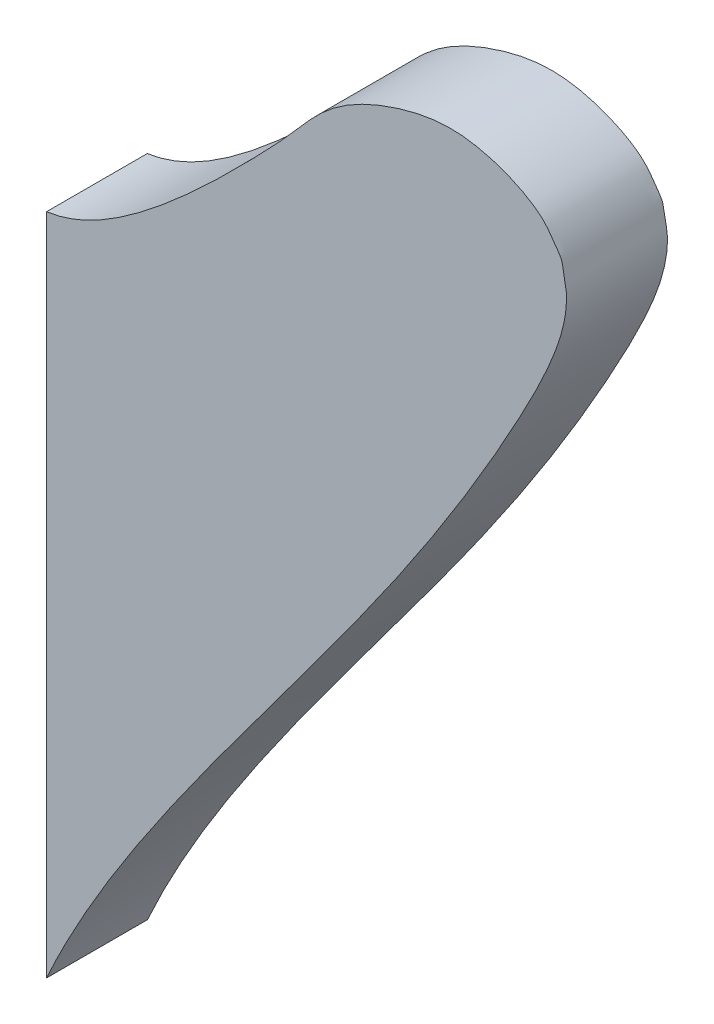
ISO-10303-21;
HEADER;
FILE_DESCRIPTION(('STEP AP214'),'2;1');
FILE_NAME('part.step','',(''),(''),'','','');
FILE_SCHEMA(('AUTOMOTIVE_DESIGN { 1 0 10303 214 1 1 1 1 }'));
ENDSEC;
DATA;
#1=APPLICATION_CONTEXT('core data for automotive mechanical design processes');
#2=APPLICATION_PROTOCOL_DEFINITION('international standard','automotive_design',2000,#1);
#3=PRODUCT_CONTEXT('',#1,'mechanical');
#4=PRODUCT('Part','Part','',(#3));
#5=PRODUCT_RELATED_PRODUCT_CATEGORY('part','',(#4));
#6=PRODUCT_DEFINITION_FORMATION('','',#4);
#7=PRODUCT_DEFINITION_CONTEXT('part definition',#1,'design');
#8=PRODUCT_DEFINITION('design','',#6,#7);
#9=PRODUCT_DEFINITION_SHAPE('','',#8);
#10=(LENGTH_UNIT() NAMED_UNIT(*) SI_UNIT(.MILLI.,.METRE.));
#11=(NAMED_UNIT(*) PLANE_ANGLE_UNIT() SI_UNIT($,.RADIAN.));
#12=(NAMED_UNIT(*) SI_UNIT($,.STERADIAN.) SOLID_ANGLE_UNIT());
#13=UNCERTAINTY_MEASURE_WITH_UNIT(LENGTH_MEASURE(1.E-05),#10,'distance_accuracy_value','');
#14=(GEOMETRIC_REPRESENTATION_CONTEXT(3) GLOBAL_UNCERTAINTY_ASSIGNED_CONTEXT((#13)) GLOBAL_UNIT_ASSIGNED_CONTEXT((#10,
#11,#12)) REPRESENTATION_CONTEXT('',''));
#15=CARTESIAN_POINT('',(0.,0.,0.));
#16=DIRECTION('',(0.,0.,1.));
#17=DIRECTION('',(1.,0.,0.));
#18=AXIS2_PLACEMENT_3D('',#15,#16,#17);
#19=CARTESIAN_POINT('',(56.6243968883205,-75.8826484864378,67.9999999999997));
#20=CARTESIAN_POINT('',(57.1956425116259,-74.6192572399872,67.9999999999997));
#21=CARTESIAN_POINT('',(57.8105643251966,-73.3695682454955,67.9999999999997));
#22=CARTESIAN_POINT('',(59.1129866999376,-70.8929599230149,67.9999999999997));
#23=CARTESIAN_POINT('',(59.7959511164579,-69.6735801309141,67.9999999999997));
#24=CARTESIAN_POINT('',(61.9128506956345,-66.0658431265041,67.9999999999997));
#25=CARTESIAN_POINT('',(63.41586879737,-63.7233398847035,67.9999999999997));
#26=CARTESIAN_POINT('',(68.0819544074626,-56.8030625835978,67.9999999999997));
#27=CARTESIAN_POINT('',(71.4008035720881,-52.3316675973996,67.9999999999997));
#28=CARTESIAN_POINT('',(76.3852152204365,-45.6287665247062,67.9999999999997));
#29=CARTESIAN_POINT('',(78.0490180191963,-43.3961231201857,67.9999999999997));
#30=CARTESIAN_POINT('',(81.3313667037283,-38.8995837933962,67.9999999999997));
#31=CARTESIAN_POINT('',(82.9473868043948,-36.6338927930608,67.9999999999997));
#32=CARTESIAN_POINT('',(86.0891610997712,-32.0399943871268,67.9999999999997));
#33=CARTESIAN_POINT('',(87.6164996172124,-29.710641318691,67.9999999999997));
#34=CARTESIAN_POINT('',(90.5528850923564,-24.9805780795596,67.9999999999997));
#35=CARTESIAN_POINT('',(91.9619280402937,-22.5832158701367,67.9999999999997));
#36=CARTESIAN_POINT('',(93.978468678918,-18.9341404799284,67.9999999999997));
#37=CARTESIAN_POINT('',(94.6360575792324,-17.7098065740976,67.9999999999997));
#38=CARTESIAN_POINT('',(95.5715451861119,-15.8454866914508,67.9999999999997));
#39=CARTESIAN_POINT('',(95.8742446304546,-15.2190565106268,67.9999999999997));
#40=CARTESIAN_POINT('',(96.4512459088168,-13.9506743441176,67.9999999999997));
#41=CARTESIAN_POINT('',(96.7253232789207,-13.3065549937712,67.9999999999997));
#42=CARTESIAN_POINT('',(97.2132446147879,-11.9946956240635,67.9999999999997));
#43=CARTESIAN_POINT('',(97.4262601888033,-11.3309091214542,67.9999999999997));
#44=CARTESIAN_POINT('',(97.6628361617602,-10.314169405239,67.9999999999997));
#45=CARTESIAN_POINT('',(97.7292554690413,-9.97209787235811,67.9999999999997));
#46=CARTESIAN_POINT('',(97.8248604442845,-9.27850135593702,67.9999999999997));
#47=CARTESIAN_POINT('',(97.8541019998468,-8.92396257798465,67.9999999999997));
#48=CARTESIAN_POINT('',(97.8479479734428,-8.40104089081836,67.9999999999997));
#49=CARTESIAN_POINT('',(97.8367540764815,-8.22785762024196,67.9999999999997));
#50=CARTESIAN_POINT('',(97.7953918159734,-7.88382374353646,67.9999999999997));
#51=CARTESIAN_POINT('',(97.7655108981713,-7.71293779968312,67.9999999999997));
#52=CARTESIAN_POINT('',(97.698003967446,-7.37211807091851,67.9999999999997));
#53=CARTESIAN_POINT('',(97.660404923098,-7.20218097057089,67.9999999999997));
#54=CARTESIAN_POINT('',(97.5952035175329,-6.86107780740515,67.9999999999997));
#55=CARTESIAN_POINT('',(97.5683680297231,-6.6898174674528,67.9999999999997));
#56=CARTESIAN_POINT('',(97.5221756562163,-6.43365709793925,67.9999999999997));
#57=CARTESIAN_POINT('',(97.5048911608089,-6.34820363557533,67.9999999999997));
#58=CARTESIAN_POINT('',(97.4554190660572,-6.18037958094073,67.9999999999997));
#59=CARTESIAN_POINT('',(97.4225272093168,-6.10086409438284,67.9999999999997));
#60=CARTESIAN_POINT('',(97.3042566038001,-5.87288070300916,67.9999999999997));
#61=CARTESIAN_POINT('',(97.2031984763459,-5.73276328046378,67.9999999999997));
#62=CARTESIAN_POINT('',(97.0045827628487,-5.45111324761475,67.9999999999997));
#63=CARTESIAN_POINT('',(96.9054512594845,-5.31015763601441,67.9999999999997));
#64=CARTESIAN_POINT('',(96.7081345218982,-5.02754567103159,67.9999999999997));
#65=CARTESIAN_POINT('',(96.6081502047399,-4.88722159461685,67.9999999999997));
#66=CARTESIAN_POINT('',(96.4003822347995,-4.61234909281722,67.9999999999997));
#67=CARTESIAN_POINT('',(96.292989024648,-4.47715754013075,67.9999999999997));
#68=CARTESIAN_POINT('',(96.0627559638792,-4.21968321423377,67.9999999999997));
#69=CARTESIAN_POINT('',(95.9414461805903,-4.09958875898011,67.9999999999997));
#70=CARTESIAN_POINT('',(95.5611603474355,-3.7621309270953,67.9999999999997));
#71=CARTESIAN_POINT('',(95.2866088678593,-3.56650312113814,67.9999999999997));
#72=CARTESIAN_POINT('',(94.4294430314856,-3.02638498457516,67.9999999999997));
#73=CARTESIAN_POINT('',(93.8139023894578,-2.72256695794317,67.9999999999997));
#74=CARTESIAN_POINT('',(92.5612042312695,-2.21843912980432,67.9999999999997));
#75=CARTESIAN_POINT('',(91.9199730880059,-2.01202844692416,67.9999999999997));
#76=CARTESIAN_POINT('',(90.6050828614641,-1.69868523322686,67.9999999999997));
#77=CARTESIAN_POINT('',(89.9268677341821,-1.59222116346258,67.9999999999997));
#78=CARTESIAN_POINT('',(88.5840345823411,-1.51505723300655,67.9999999999997));
#79=CARTESIAN_POINT('',(87.9141205312446,-1.54368907805067,67.9999999999997));
#80=CARTESIAN_POINT('',(86.5767767620458,-1.71208669676027,67.9999999999997));
#81=CARTESIAN_POINT('',(85.9076331180618,-1.85264133443855,67.9999999999997));
#82=CARTESIAN_POINT('',(84.6060044032569,-2.20226527120153,67.9999999999997));
#83=CARTESIAN_POINT('',(83.9670295398703,-2.40917016426315,67.9999999999997));
#84=CARTESIAN_POINT('',(82.7113221132215,-2.88327141737424,67.9999999999997));
#85=CARTESIAN_POINT('',(82.094723005275,-3.150829530332,67.9999999999997));
#86=CARTESIAN_POINT('',(81.1919669300859,-3.61218787695929,67.9999999999997));
#87=CARTESIAN_POINT('',(80.893524101022,-3.7769713549058,67.9999999999997));
#88=CARTESIAN_POINT('',(80.3125081029548,-4.12624263406909,67.9999999999997));
#89=CARTESIAN_POINT('',(80.0304640743729,-4.31043748003391,67.9999999999997));
#90=CARTESIAN_POINT('',(79.2107847023737,-4.8928977070669,67.9999999999997));
#91=CARTESIAN_POINT('',(78.7004299539818,-5.32197378620994,67.9999999999997));
#92=CARTESIAN_POINT('',(77.7427371771104,-6.25129701422813,67.9999999999997));
#93=CARTESIAN_POINT('',(77.292852530074,-6.74866801266026,67.9999999999997));
#94=CARTESIAN_POINT('',(76.4034403788606,-7.75510736441196,67.9999999999997));
#95=CARTESIAN_POINT('',(75.9653873495744,-8.26535440307391,67.9999999999997));
#96=CARTESIAN_POINT('',(74.6246472010139,-9.76999906766912,67.9999999999997));
#97=CARTESIAN_POINT('',(73.6898354937796,-10.734128970733,67.9999999999997));
#98=CARTESIAN_POINT('',(71.8014456593892,-12.6445465541986,67.9999999999997));
#99=CARTESIAN_POINT('',(70.8520595026556,-13.5956663871862,67.9999999999997));
#100=CARTESIAN_POINT('',(68.9187317899475,-15.4597570797874,67.9999999999997));
#101=CARTESIAN_POINT('',(67.9327373498953,-16.3704268166374,67.9999999999997));
#102=CARTESIAN_POINT('',(65.9084702095195,-18.1339573958019,67.9999999999997));
#103=CARTESIAN_POINT('',(64.8687643562038,-18.9907957412065,67.9999999999997));
#104=CARTESIAN_POINT('',(63.2554638408371,-20.1886633041375,67.9999999999997));
#105=CARTESIAN_POINT('',(62.7084520293485,-20.5731669126561,67.9999999999997));
#106=CARTESIAN_POINT('',(61.5884755974614,-21.3006675392165,67.9999999999997));
#107=CARTESIAN_POINT('',(61.0156489552363,-21.6438852271502,67.9999999999997));
#108=CARTESIAN_POINT('',(60.1273087559626,-22.1121714566125,67.9999999999997));
#109=CARTESIAN_POINT('',(59.8262928684722,-22.2604262680865,67.9999999999997));
#110=CARTESIAN_POINT('',(59.2118356959093,-22.5370638266758,67.9999999999997));
#111=CARTESIAN_POINT('',(58.8968514073404,-22.6659741589894,67.9999999999997));
#112=CARTESIAN_POINT('',(57.9418356908704,-23.009389244802,67.9999999999997));
#113=CARTESIAN_POINT('',(57.2922297792434,-23.1812096780764,67.9999999999997));
#114=CARTESIAN_POINT('',(56.6243968883146,-23.2724981523089,67.9999999999997));
#115=B_SPLINE_CURVE_WITH_KNOTS('',3,(#19,#20,#21,#22,#23,#24,#25,#26,#27,#28,#29,#30,#31,#32,
#33,#34,#35,#36,#37,#38,#39,#40,#41,#42,#43,#44,#45,#46,#47,#48,#49,#50,#51,#52,#53,#54,#55,#56,
#57,#58,#59,#60,#61,#62,#63,#64,#65,#66,#67,#68,#69,#70,#71,#72,#73,#74,#75,#76,#77,#78,#79,#80,
#81,#82,#83,#84,#85,#86,#87,#88,#89,#90,#91,#92,#93,#94,#95,#96,#97,#98,#99,#100,#101,#102,#103,
#104,#105,#106,#107,#108,#109,#110,#111,#112,#113,#114),.UNSPECIFIED.,.F.,.F.,(4,2,2,2,2,2,2,2,
2,2,2,2,2,2,2,2,2,2,2,2,2,2,2,2,2,2,2,2,2,2,2,2,2,2,2,2,2,2,2,2,2,2,2,2,2,2,2,4),(0.,
0.0312499999999996,0.062499999999999,0.124999999999998,0.249999999999995,0.312499999999994,
0.374999999999993,0.437499999999992,0.499999999999991,0.53124999999999,0.54687499999999,
0.56249999999999,0.578124999999989,0.585937499999989,0.593749999999989,0.597656249999989,
0.601562499999989,0.605468749999989,0.609374999999989,0.611328124999989,0.613281249999989,
0.617187499999989,0.621093749999989,0.624999999999988,0.628906249999988,0.632812499999988,
0.640624999999989,0.656249999999989,0.671874999999989,0.68749999999999,0.70312499999999,
0.71874999999999,0.734374999999991,0.749999999999991,0.757812499999991,0.765624999999991,
0.781249999999992,0.796874999999993,0.812499999999993,0.843749999999995,0.874999999999996,
0.906249999999997,0.937499999999998,0.953124999999999,0.968749999999999,0.976562499999999,
0.984375,1.),.UNSPECIFIED.);
#116=DIRECTION('',(0.,0.,-1.));
#117=VECTOR('',#116,1.);
#118=SURFACE_OF_LINEAR_EXTRUSION('',#115,#117);
#119=CARTESIAN_POINT('',(56.6243968883205,-75.8826484864378,59.9999999999998));
#120=CARTESIAN_POINT('',(57.1956425116259,-74.6192572399872,59.9999999999998));
#121=CARTESIAN_POINT('',(57.8105643251966,-73.3695682454955,59.9999999999998));
#122=CARTESIAN_POINT('',(59.1129866999376,-70.8929599230149,59.9999999999998));
#123=CARTESIAN_POINT('',(59.7959511164579,-69.6735801309141,59.9999999999998));
#124=CARTESIAN_POINT('',(61.9128506956345,-66.0658431265041,59.9999999999998));
#125=CARTESIAN_POINT('',(63.41586879737,-63.7233398847035,59.9999999999998));
#126=CARTESIAN_POINT('',(68.0819544074626,-56.8030625835978,59.9999999999998));
#127=CARTESIAN_POINT('',(71.4008035720881,-52.3316675973996,59.9999999999998));
#128=CARTESIAN_POINT('',(76.3852152204365,-45.6287665247062,59.9999999999998));
#129=CARTESIAN_POINT('',(78.0490180191963,-43.3961231201857,59.9999999999998));
#130=CARTESIAN_POINT('',(81.3313667037283,-38.8995837933962,59.9999999999998));
#131=CARTESIAN_POINT('',(82.9473868043948,-36.6338927930608,59.9999999999998));
#132=CARTESIAN_POINT('',(86.0891610997712,-32.0399943871268,59.9999999999998));
#133=CARTESIAN_POINT('',(87.6164996172124,-29.710641318691,59.9999999999998));
#134=CARTESIAN_POINT('',(90.5528850923564,-24.9805780795596,59.9999999999998));
#135=CARTESIAN_POINT('',(91.9619280402937,-22.5832158701367,59.9999999999998));
#136=CARTESIAN_POINT('',(93.978468678918,-18.9341404799284,59.9999999999998));
#137=CARTESIAN_POINT('',(94.6360575792324,-17.7098065740976,59.9999999999998));
#138=CARTESIAN_POINT('',(95.5715451861119,-15.8454866914508,59.9999999999998));
#139=CARTESIAN_POINT('',(95.8742446304546,-15.2190565106268,59.9999999999998));
#140=CARTESIAN_POINT('',(96.4512459088168,-13.9506743441176,59.9999999999998));
#141=CARTESIAN_POINT('',(96.7253232789207,-13.3065549937712,59.9999999999998));
#142=CARTESIAN_POINT('',(97.2132446147879,-11.9946956240635,59.9999999999998));
#143=CARTESIAN_POINT('',(97.4262601888033,-11.3309091214542,59.9999999999998));
#144=CARTESIAN_POINT('',(97.6628361617602,-10.314169405239,59.9999999999998));
#145=CARTESIAN_POINT('',(97.7292554690413,-9.97209787235811,59.9999999999998));
#146=CARTESIAN_POINT('',(97.8248604442845,-9.27850135593702,59.9999999999998));
#147=CARTESIAN_POINT('',(97.8541019998468,-8.92396257798465,59.9999999999998));
#148=CARTESIAN_POINT('',(97.8479479734428,-8.40104089081836,59.9999999999998));
#149=CARTESIAN_POINT('',(97.8367540764815,-8.22785762024196,59.9999999999998));
#150=CARTESIAN_POINT('',(97.7953918159734,-7.88382374353646,59.9999999999998));
#151=CARTESIAN_POINT('',(97.7655108981713,-7.71293779968312,59.9999999999998));
#152=CARTESIAN_POINT('',(97.698003967446,-7.37211807091851,59.9999999999998));
#153=CARTESIAN_POINT('',(97.660404923098,-7.20218097057089,59.9999999999998));
#154=CARTESIAN_POINT('',(97.5952035175329,-6.86107780740515,59.9999999999998));
#155=CARTESIAN_POINT('',(97.5683680297231,-6.6898174674528,59.9999999999998));
#156=CARTESIAN_POINT('',(97.5221756562163,-6.43365709793925,59.9999999999998));
#157=CARTESIAN_POINT('',(97.5048911608089,-6.34820363557533,59.9999999999998));
#158=CARTESIAN_POINT('',(97.4554190660572,-6.18037958094073,59.9999999999998));
#159=CARTESIAN_POINT('',(97.4225272093168,-6.10086409438284,59.9999999999998));
#160=CARTESIAN_POINT('',(97.3042566038001,-5.87288070300916,59.9999999999998));
#161=CARTESIAN_POINT('',(97.2031984763459,-5.73276328046378,59.9999999999998));
#162=CARTESIAN_POINT('',(97.0045827628487,-5.45111324761475,59.9999999999998));
#163=CARTESIAN_POINT('',(96.9054512594845,-5.31015763601441,59.9999999999998));
#164=CARTESIAN_POINT('',(96.7081345218982,-5.02754567103159,59.9999999999998));
#165=CARTESIAN_POINT('',(96.6081502047399,-4.88722159461685,59.9999999999998));
#166=CARTESIAN_POINT('',(96.4003822347995,-4.61234909281722,59.9999999999998));
#167=CARTESIAN_POINT('',(96.292989024648,-4.47715754013075,59.9999999999998));
#168=CARTESIAN_POINT('',(96.0627559638792,-4.21968321423377,59.9999999999998));
#169=CARTESIAN_POINT('',(95.9414461805903,-4.09958875898011,59.9999999999998));
#170=CARTESIAN_POINT('',(95.5611603474355,-3.7621309270953,59.9999999999998));
#171=CARTESIAN_POINT('',(95.2866088678593,-3.56650312113814,59.9999999999998));
#172=CARTESIAN_POINT('',(94.4294430314856,-3.02638498457516,59.9999999999998));
#173=CARTESIAN_POINT('',(93.8139023894578,-2.72256695794317,59.9999999999998));
#174=CARTESIAN_POINT('',(92.5612042312695,-2.21843912980432,59.9999999999998));
#175=CARTESIAN_POINT('',(91.9199730880059,-2.01202844692416,59.9999999999998));
#176=CARTESIAN_POINT('',(90.6050828614641,-1.69868523322686,59.9999999999998));
#177=CARTESIAN_POINT('',(89.9268677341821,-1.59222116346258,59.9999999999998));
#178=CARTESIAN_POINT('',(88.5840345823411,-1.51505723300655,59.9999999999998));
#179=CARTESIAN_POINT('',(87.9141205312446,-1.54368907805067,59.9999999999998));
#180=CARTESIAN_POINT('',(86.5767767620458,-1.71208669676027,59.9999999999998));
#181=CARTESIAN_POINT('',(85.9076331180618,-1.85264133443855,59.9999999999998));
#182=CARTESIAN_POINT('',(84.6060044032569,-2.20226527120153,59.9999999999998));
#183=CARTESIAN_POINT('',(83.9670295398703,-2.40917016426315,59.9999999999998));
#184=CARTESIAN_POINT('',(82.7113221132215,-2.88327141737424,59.9999999999998));
#185=CARTESIAN_POINT('',(82.094723005275,-3.150829530332,59.9999999999998));
#186=CARTESIAN_POINT('',(81.1919669300859,-3.61218787695929,59.9999999999998));
#187=CARTESIAN_POINT('',(80.893524101022,-3.7769713549058,59.9999999999998));
#188=CARTESIAN_POINT('',(80.3125081029548,-4.12624263406909,59.9999999999998));
#189=CARTESIAN_POINT('',(80.0304640743729,-4.31043748003391,59.9999999999998));
#190=CARTESIAN_POINT('',(79.2107847023737,-4.8928977070669,59.9999999999998));
#191=CARTESIAN_POINT('',(78.7004299539818,-5.32197378620994,59.9999999999998));
#192=CARTESIAN_POINT('',(77.7427371771104,-6.25129701422813,59.9999999999998));
#193=CARTESIAN_POINT('',(77.292852530074,-6.74866801266026,59.9999999999998));
#194=CARTESIAN_POINT('',(76.4034403788606,-7.75510736441196,59.9999999999998));
#195=CARTESIAN_POINT('',(75.9653873495744,-8.26535440307391,59.9999999999998));
#196=CARTESIAN_POINT('',(74.6246472010139,-9.76999906766912,59.9999999999998));
#197=CARTESIAN_POINT('',(73.6898354937796,-10.734128970733,59.9999999999998));
#198=CARTESIAN_POINT('',(71.8014456593892,-12.6445465541986,59.9999999999998));
#199=CARTESIAN_POINT('',(70.8520595026556,-13.5956663871862,59.9999999999998));
#200=CARTESIAN_POINT('',(68.9187317899475,-15.4597570797874,59.9999999999998));
#201=CARTESIAN_POINT('',(67.9327373498953,-16.3704268166374,59.9999999999998));
#202=CARTESIAN_POINT('',(65.9084702095195,-18.1339573958019,59.9999999999998));
#203=CARTESIAN_POINT('',(64.8687643562038,-18.9907957412065,59.9999999999998));
#204=CARTESIAN_POINT('',(63.2554638408371,-20.1886633041375,59.9999999999998));
#205=CARTESIAN_POINT('',(62.7084520293485,-20.5731669126561,59.9999999999998));
#206=CARTESIAN_POINT('',(61.5884755974614,-21.3006675392165,59.9999999999998));
#207=CARTESIAN_POINT('',(61.0156489552363,-21.6438852271502,59.9999999999998));
#208=CARTESIAN_POINT('',(60.1273087559626,-22.1121714566125,59.9999999999998));
#209=CARTESIAN_POINT('',(59.8262928684722,-22.2604262680865,59.9999999999998));
#210=CARTESIAN_POINT('',(59.2118356959093,-22.5370638266758,59.9999999999998));
#211=CARTESIAN_POINT('',(58.8968514073404,-22.6659741589894,59.9999999999998));
#212=CARTESIAN_POINT('',(57.9418356908704,-23.009389244802,59.9999999999998));
#213=CARTESIAN_POINT('',(57.2922297792434,-23.1812096780764,59.9999999999998));
#214=CARTESIAN_POINT('',(56.6243968883146,-23.2724981523089,59.9999999999998));
#215=B_SPLINE_CURVE_WITH_KNOTS('',3,(#119,#120,#121,#122,#123,#124,#125,#126,#127,#128,#129,
#130,#131,#132,#133,#134,#135,#136,#137,#138,#139,#140,#141,#142,#143,#144,#145,#146,#147,#148,
#149,#150,#151,#152,#153,#154,#155,#156,#157,#158,#159,#160,#161,#162,#163,#164,#165,#166,#167,
#168,#169,#170,#171,#172,#173,#174,#175,#176,#177,#178,#179,#180,#181,#182,#183,#184,#185,#186,
#187,#188,#189,#190,#191,#192,#193,#194,#195,#196,#197,#198,#199,#200,#201,#202,#203,#204,#205,
#206,#207,#208,#209,#210,#211,#212,#213,#214),.UNSPECIFIED.,.F.,.F.,(4,2,2,2,2,2,2,2,2,2,2,2,2,
2,2,2,2,2,2,2,2,2,2,2,2,2,2,2,2,2,2,2,2,2,2,2,2,2,2,2,2,2,2,2,2,2,2,4),(0.,0.0312499999999996,
0.062499999999999,0.124999999999998,0.249999999999995,0.312499999999994,0.374999999999993,
0.437499999999992,0.499999999999991,0.53124999999999,0.54687499999999,0.56249999999999,
0.578124999999989,0.585937499999989,0.593749999999989,0.597656249999989,0.601562499999989,
0.605468749999989,0.609374999999989,0.611328124999989,0.613281249999989,0.617187499999989,
0.621093749999989,0.624999999999988,0.628906249999988,0.632812499999988,0.640624999999989,
0.656249999999989,0.671874999999989,0.68749999999999,0.70312499999999,0.71874999999999,
0.734374999999991,0.749999999999991,0.757812499999991,0.765624999999991,0.781249999999992,
0.796874999999993,0.812499999999993,0.843749999999995,0.874999999999996,0.906249999999997,
0.937499999999998,0.953124999999999,0.968749999999999,0.976562499999999,0.984375,1.),.UNSPECIFIED.);
#216=CARTESIAN_POINT('',(56.6243968883148,-75.8826484864506,59.9999999999997));
#217=VERTEX_POINT('',#216);
#218=CARTESIAN_POINT('',(56.6243968883148,-23.2724981523089,59.9999999999997));
#219=VERTEX_POINT('',#218);
#220=EDGE_CURVE('E65',#217,#219,#215,.T.);
#221=ORIENTED_EDGE('',*,*,#220,.T.);
#222=DIRECTION('',(0.,0.,-1.));
#223=VECTOR('',#222,1.);
#224=CARTESIAN_POINT('',(56.6243968883148,-23.2724981523089,67.9999999999997));
#225=LINE('',#224,#223);
#226=CARTESIAN_POINT('',(56.6243968883148,-23.2724981523089,67.9999999999997));
#227=VERTEX_POINT('',#226);
#228=EDGE_CURVE('E11',#227,#219,#225,.T.);
#229=ORIENTED_EDGE('',*,*,#228,.F.);
#230=CARTESIAN_POINT('',(56.6243968883146,-23.2724981523089,67.9999999999997));
#231=CARTESIAN_POINT('',(57.2922297792434,-23.1812096780764,67.9999999999997));
#232=CARTESIAN_POINT('',(57.9418356908704,-23.009389244802,67.9999999999997));
#233=CARTESIAN_POINT('',(58.8968514073404,-22.6659741589894,67.9999999999997));
#234=CARTESIAN_POINT('',(59.2118356959093,-22.5370638266758,67.9999999999997));
#235=CARTESIAN_POINT('',(59.8262928684722,-22.2604262680865,67.9999999999997));
#236=CARTESIAN_POINT('',(60.1273087559626,-22.1121714566125,67.9999999999997));
#237=CARTESIAN_POINT('',(61.0156489552363,-21.6438852271502,67.9999999999997));
#238=CARTESIAN_POINT('',(61.5884755974614,-21.3006675392165,67.9999999999997));
#239=CARTESIAN_POINT('',(62.7084520293485,-20.5731669126561,67.9999999999997));
#240=CARTESIAN_POINT('',(63.2554638408371,-20.1886633041375,67.9999999999997));
#241=CARTESIAN_POINT('',(64.8687643562038,-18.9907957412065,67.9999999999997));
#242=CARTESIAN_POINT('',(65.9084702095195,-18.1339573958019,67.9999999999997));
#243=CARTESIAN_POINT('',(67.9327373498953,-16.3704268166374,67.9999999999997));
#244=CARTESIAN_POINT('',(68.9187317899475,-15.4597570797874,67.9999999999997));
#245=CARTESIAN_POINT('',(70.8520595026556,-13.5956663871862,67.9999999999997));
#246=CARTESIAN_POINT('',(71.8014456593892,-12.6445465541986,67.9999999999997));
#247=CARTESIAN_POINT('',(73.6898354937796,-10.734128970733,67.9999999999997));
#248=CARTESIAN_POINT('',(74.6246472010139,-9.76999906766912,67.9999999999997));
#249=CARTESIAN_POINT('',(75.9653873495744,-8.26535440307391,67.9999999999997));
#250=CARTESIAN_POINT('',(76.4034403788606,-7.75510736441196,67.9999999999997));
#251=CARTESIAN_POINT('',(77.292852530074,-6.74866801266026,67.9999999999997));
#252=CARTESIAN_POINT('',(77.7427371771104,-6.25129701422813,67.9999999999997));
#253=CARTESIAN_POINT('',(78.7004299539818,-5.32197378620994,67.9999999999997));
#254=CARTESIAN_POINT('',(79.2107847023737,-4.8928977070669,67.9999999999997));
#255=CARTESIAN_POINT('',(80.0304640743729,-4.31043748003391,67.9999999999997));
#256=CARTESIAN_POINT('',(80.3125081029548,-4.12624263406909,67.9999999999997));
#257=CARTESIAN_POINT('',(80.893524101022,-3.7769713549058,67.9999999999997));
#258=CARTESIAN_POINT('',(81.1919669300859,-3.61218787695929,67.9999999999997));
#259=CARTESIAN_POINT('',(82.094723005275,-3.150829530332,67.9999999999997));
#260=CARTESIAN_POINT('',(82.7113221132215,-2.88327141737424,67.9999999999997));
#261=CARTESIAN_POINT('',(83.9670295398703,-2.40917016426315,67.9999999999997));
#262=CARTESIAN_POINT('',(84.6060044032569,-2.20226527120153,67.9999999999997));
#263=CARTESIAN_POINT('',(85.9076331180618,-1.85264133443855,67.9999999999997));
#264=CARTESIAN_POINT('',(86.5767767620458,-1.71208669676027,67.9999999999997));
#265=CARTESIAN_POINT('',(87.9141205312446,-1.54368907805067,67.9999999999997));
#266=CARTESIAN_POINT('',(88.5840345823411,-1.51505723300655,67.9999999999997));
#267=CARTESIAN_POINT('',(89.9268677341821,-1.59222116346258,67.9999999999997));
#268=CARTESIAN_POINT('',(90.6050828614641,-1.69868523322686,67.9999999999997));
#269=CARTESIAN_POINT('',(91.9199730880059,-2.01202844692416,67.9999999999997));
#270=CARTESIAN_POINT('',(92.5612042312695,-2.21843912980432,67.9999999999997));
#271=CARTESIAN_POINT('',(93.8139023894578,-2.72256695794317,67.9999999999997));
#272=CARTESIAN_POINT('',(94.4294430314856,-3.02638498457516,67.9999999999997));
#273=CARTESIAN_POINT('',(95.2866088678593,-3.56650312113814,67.9999999999997));
#274=CARTESIAN_POINT('',(95.5611603474355,-3.7621309270953,67.9999999999997));
#275=CARTESIAN_POINT('',(95.9414461805903,-4.09958875898011,67.9999999999997));
#276=CARTESIAN_POINT('',(96.0627559638792,-4.21968321423377,67.9999999999997));
#277=CARTESIAN_POINT('',(96.292989024648,-4.47715754013075,67.9999999999997));
#278=CARTESIAN_POINT('',(96.4003822347995,-4.61234909281722,67.9999999999997));
#279=CARTESIAN_POINT('',(96.6081502047399,-4.88722159461685,67.9999999999997));
#280=CARTESIAN_POINT('',(96.7081345218982,-5.02754567103159,67.9999999999997));
#281=CARTESIAN_POINT('',(96.9054512594845,-5.31015763601441,67.9999999999997));
#282=CARTESIAN_POINT('',(97.0045827628487,-5.45111324761475,67.9999999999997));
#283=CARTESIAN_POINT('',(97.2031984763459,-5.73276328046378,67.9999999999997));
#284=CARTESIAN_POINT('',(97.3042566038001,-5.87288070300916,67.9999999999997));
#285=CARTESIAN_POINT('',(97.4225272093168,-6.10086409438284,67.9999999999997));
#286=CARTESIAN_POINT('',(97.4554190660572,-6.18037958094073,67.9999999999997));
#287=CARTESIAN_POINT('',(97.5048911608089,-6.34820363557533,67.9999999999997));
#288=CARTESIAN_POINT('',(97.5221756562163,-6.43365709793925,67.9999999999997));
#289=CARTESIAN_POINT('',(97.5683680297231,-6.6898174674528,67.9999999999997));
#290=CARTESIAN_POINT('',(97.5952035175329,-6.86107780740515,67.9999999999997));
#291=CARTESIAN_POINT('',(97.660404923098,-7.20218097057089,67.9999999999997));
#292=CARTESIAN_POINT('',(97.698003967446,-7.37211807091851,67.9999999999997));
#293=CARTESIAN_POINT('',(97.7655108981713,-7.71293779968312,67.9999999999997));
#294=CARTESIAN_POINT('',(97.7953918159734,-7.88382374353646,67.9999999999997));
#295=CARTESIAN_POINT('',(97.8367540764815,-8.22785762024196,67.9999999999997));
#296=CARTESIAN_POINT('',(97.8479479734428,-8.40104089081836,67.9999999999997));
#297=CARTESIAN_POINT('',(97.8541019998468,-8.92396257798465,67.9999999999997));
#298=CARTESIAN_POINT('',(97.8248604442845,-9.27850135593702,67.9999999999997));
#299=CARTESIAN_POINT('',(97.7292554690413,-9.97209787235811,67.9999999999997));
#300=CARTESIAN_POINT('',(97.6628361617602,-10.314169405239,67.9999999999997));
#301=CARTESIAN_POINT('',(97.4262601888033,-11.3309091214542,67.9999999999997));
#302=CARTESIAN_POINT('',(97.2132446147879,-11.9946956240635,67.9999999999997));
#303=CARTESIAN_POINT('',(96.7253232789207,-13.3065549937712,67.9999999999997));
#304=CARTESIAN_POINT('',(96.4512459088168,-13.9506743441176,67.9999999999997));
#305=CARTESIAN_POINT('',(95.8742446304546,-15.2190565106268,67.9999999999997));
#306=CARTESIAN_POINT('',(95.5715451861119,-15.8454866914508,67.9999999999997));
#307=CARTESIAN_POINT('',(94.6360575792324,-17.7098065740976,67.9999999999997));
#308=CARTESIAN_POINT('',(93.978468678918,-18.9341404799284,67.9999999999997));
#309=CARTESIAN_POINT('',(91.9619280402937,-22.5832158701367,67.9999999999997));
#310=CARTESIAN_POINT('',(90.5528850923564,-24.9805780795596,67.9999999999997));
#311=CARTESIAN_POINT('',(87.6164996172124,-29.710641318691,67.9999999999997));
#312=CARTESIAN_POINT('',(86.0891610997712,-32.0399943871268,67.9999999999997));
#313=CARTESIAN_POINT('',(82.9473868043948,-36.6338927930608,67.9999999999997));
#314=CARTESIAN_POINT('',(81.3313667037283,-38.8995837933962,67.9999999999997));
#315=CARTESIAN_POINT('',(78.0490180191963,-43.3961231201857,67.9999999999997));
#316=CARTESIAN_POINT('',(76.3852152204365,-45.6287665247062,67.9999999999997));
#317=CARTESIAN_POINT('',(71.4008035720881,-52.3316675973996,67.9999999999997));
#318=CARTESIAN_POINT('',(68.0819544074626,-56.8030625835978,67.9999999999997));
#319=CARTESIAN_POINT('',(63.41586879737,-63.7233398847035,67.9999999999997));
#320=CARTESIAN_POINT('',(61.9128506956345,-66.0658431265041,67.9999999999997));
#321=CARTESIAN_POINT('',(59.7959511164579,-69.6735801309141,67.9999999999997));
#322=CARTESIAN_POINT('',(59.1129866999376,-70.8929599230149,67.9999999999997));
#323=CARTESIAN_POINT('',(57.8105643251966,-73.3695682454955,67.9999999999997));
#324=CARTESIAN_POINT('',(57.1956425116259,-74.6192572399872,67.9999999999997));
#325=CARTESIAN_POINT('',(56.6243968883205,-75.8826484864378,67.9999999999997));
#326=B_SPLINE_CURVE_WITH_KNOTS('',3,(#230,#231,#232,#233,#234,#235,#236,#237,#238,#239,#240,
#241,#242,#243,#244,#245,#246,#247,#248,#249,#250,#251,#252,#253,#254,#255,#256,#257,#258,#259,
#260,#261,#262,#263,#264,#265,#266,#267,#268,#269,#270,#271,#272,#273,#274,#275,#276,#277,#278,
#279,#280,#281,#282,#283,#284,#285,#286,#287,#288,#289,#290,#291,#292,#293,#294,#295,#296,#297,
#298,#299,#300,#301,#302,#303,#304,#305,#306,#307,#308,#309,#310,#311,#312,#313,#314,#315,#316,
#317,#318,#319,#320,#321,#322,#323,#324,#325),.UNSPECIFIED.,.F.,.F.,(4,2,2,2,2,2,2,2,2,2,2,2,2,
2,2,2,2,2,2,2,2,2,2,2,2,2,2,2,2,2,2,2,2,2,2,2,2,2,2,2,2,2,2,2,2,2,2,4),(0.,0.0156250000000004,
0.0234375000000007,0.0312500000000009,0.0468750000000013,0.0625000000000018,0.093750000000003,
0.125000000000004,0.156250000000005,0.187500000000007,0.203125000000007,0.218750000000008,
0.234375000000009,0.242187500000009,0.250000000000009,0.265625000000009,0.28125000000001,
0.29687500000001,0.31250000000001,0.328125000000011,0.343750000000011,0.359375000000011,
0.367187500000012,0.371093750000012,0.375000000000012,0.378906250000011,0.382812500000011,
0.386718750000011,0.388671875000011,0.390625000000011,0.394531250000011,0.398437500000011,
0.402343750000011,0.406250000000011,0.414062500000011,0.421875000000011,0.43750000000001,
0.45312500000001,0.46875000000001,0.500000000000009,0.562500000000008,0.625000000000007,
0.687500000000006,0.750000000000005,0.875000000000002,0.937500000000001,0.96875,1.),.UNSPECIFIED.);
#327=CARTESIAN_POINT('',(56.6243968883148,-75.8826484864506,67.9999999999997));
#328=VERTEX_POINT('',#327);
#329=EDGE_CURVE('E64',#328,#227,#326,.F.);
#330=ORIENTED_EDGE('',*,*,#329,.F.);
#331=DIRECTION('',(0.,0.,-1.));
#332=VECTOR('',#331,1.);
#333=CARTESIAN_POINT('',(56.6243968883148,-75.8826484864506,67.9999999999997));
#334=LINE('',#333,#332);
#335=EDGE_CURVE('E41',#328,#217,#334,.T.);
#336=ORIENTED_EDGE('',*,*,#335,.T.);
#337=EDGE_LOOP('',(#221,#229,#330,#336));
#338=FACE_BOUND('',#337,.T.);
#339=ADVANCED_FACE('F30',(#338),#118,.F.);
#340=CARTESIAN_POINT('',(56.6243968883148,-75.8826484864506,67.9999999999997));
#341=DIRECTION('',(1.,0.,0.));
#342=DIRECTION('',(0.,1.,0.));
#343=AXIS2_PLACEMENT_3D('',#340,#341,#342);
#344=PLANE('',#343);
#345=DIRECTION('',(0.,-1.,0.));
#346=VECTOR('',#345,1.);
#347=CARTESIAN_POINT('',(56.6243968883148,-75.8826484864506,59.9999999999997));
#348=LINE('',#347,#346);
#349=EDGE_CURVE('E57',#219,#217,#348,.T.);
#350=ORIENTED_EDGE('',*,*,#349,.T.);
#351=ORIENTED_EDGE('',*,*,#335,.F.);
#352=DIRECTION('',(0.,-1.,0.));
#353=VECTOR('',#352,1.);
#354=CARTESIAN_POINT('',(56.6243968883148,-75.8826484864506,67.9999999999997));
#355=LINE('',#354,#353);
#356=EDGE_CURVE('E49',#227,#328,#355,.T.);
#357=ORIENTED_EDGE('',*,*,#356,.F.);
#358=ORIENTED_EDGE('',*,*,#228,.T.);
#359=EDGE_LOOP('',(#350,#351,#357,#358));
#360=FACE_BOUND('',#359,.T.);
#361=ADVANCED_FACE('F60',(#360),#344,.F.);
#362=CARTESIAN_POINT('',(93.3062884660438,-20.1504989433301,67.9999999999997));
#363=DIRECTION('',(0.,0.,-1.));
#364=DIRECTION('',(-1.,0.,0.));
#365=AXIS2_PLACEMENT_3D('',#362,#363,#364);
#366=PLANE('',#365);
#367=ORIENTED_EDGE('',*,*,#329,.T.);
#368=ORIENTED_EDGE('',*,*,#356,.T.);
#369=EDGE_LOOP('',(#367,#368));
#370=FACE_BOUND('',#369,.T.);
#371=ADVANCED_FACE('F87',(#370),#366,.F.);
#372=CARTESIAN_POINT('',(93.3062884660438,-20.1504989433301,59.9999999999997));
#373=DIRECTION('',(0.,0.,-1.));
#374=DIRECTION('',(-1.,0.,0.));
#375=AXIS2_PLACEMENT_3D('',#372,#373,#374);
#376=PLANE('',#375);
#377=ORIENTED_EDGE('',*,*,#220,.F.);
#378=ORIENTED_EDGE('',*,*,#349,.F.);
#379=EDGE_LOOP('',(#377,#378));
#380=FACE_BOUND('',#379,.T.);
#381=ADVANCED_FACE('F71',(#380),#376,.T.);
#382=CLOSED_SHELL('',(#339,#361,#371,#381));
#383=MANIFOLD_SOLID_BREP('B2',#382);
#384=ADVANCED_BREP_SHAPE_REPRESENTATION('',(#18,#383),#14);
#385=SHAPE_DEFINITION_REPRESENTATION(#9,#384);
ENDSEC;
END-ISO-10303-21;
